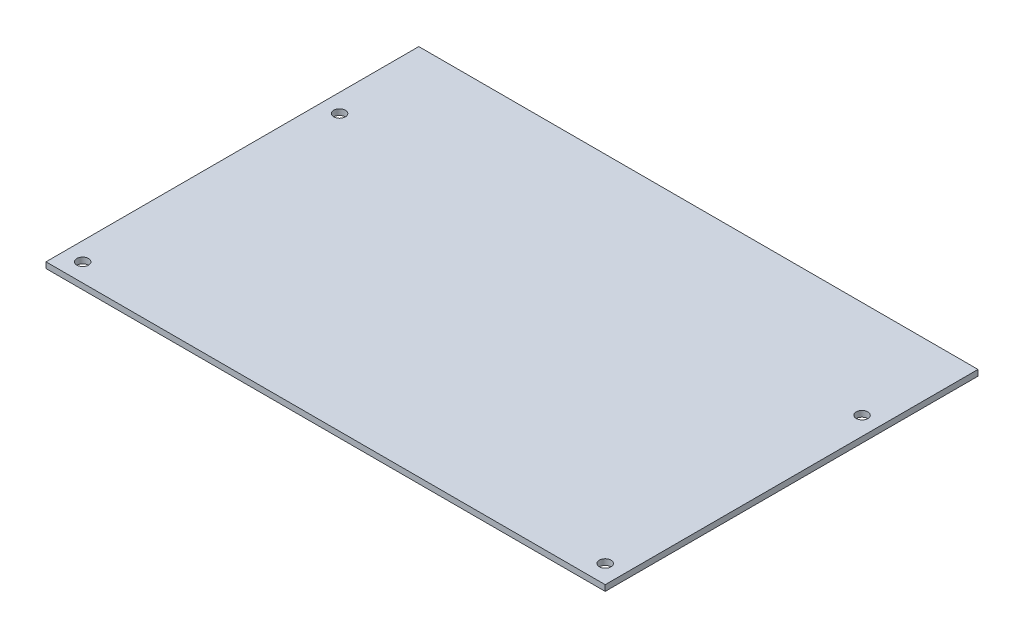
ISO-10303-21;
HEADER;
FILE_DESCRIPTION(('STEP AP214'),'2;1');
FILE_NAME('part.step','',(''),(''),'','','');
FILE_SCHEMA(('AUTOMOTIVE_DESIGN { 1 0 10303 214 1 1 1 1 }'));
ENDSEC;
DATA;
#1=APPLICATION_CONTEXT('core data for automotive mechanical design processes');
#2=APPLICATION_PROTOCOL_DEFINITION('international standard','automotive_design',2000,#1);
#3=PRODUCT_CONTEXT('',#1,'mechanical');
#4=PRODUCT('Part','Part','',(#3));
#5=PRODUCT_RELATED_PRODUCT_CATEGORY('part','',(#4));
#6=PRODUCT_DEFINITION_FORMATION('','',#4);
#7=PRODUCT_DEFINITION_CONTEXT('part definition',#1,'design');
#8=PRODUCT_DEFINITION('design','',#6,#7);
#9=PRODUCT_DEFINITION_SHAPE('','',#8);
#10=(LENGTH_UNIT() NAMED_UNIT(*) SI_UNIT(.MILLI.,.METRE.));
#11=(NAMED_UNIT(*) PLANE_ANGLE_UNIT() SI_UNIT($,.RADIAN.));
#12=(NAMED_UNIT(*) SI_UNIT($,.STERADIAN.) SOLID_ANGLE_UNIT());
#13=UNCERTAINTY_MEASURE_WITH_UNIT(LENGTH_MEASURE(1.E-05),#10,'distance_accuracy_value','');
#14=(GEOMETRIC_REPRESENTATION_CONTEXT(3) GLOBAL_UNCERTAINTY_ASSIGNED_CONTEXT((#13)) GLOBAL_UNIT_ASSIGNED_CONTEXT((#10,
#11,#12)) REPRESENTATION_CONTEXT('',''));
#15=CARTESIAN_POINT('',(0.,0.,0.));
#16=DIRECTION('',(0.,0.,1.));
#17=DIRECTION('',(1.,0.,0.));
#18=AXIS2_PLACEMENT_3D('',#15,#16,#17);
#19=CARTESIAN_POINT('',(0.,0.,0.));
#20=DIRECTION('',(0.,1.,0.));
#21=DIRECTION('',(0.,0.,1.));
#22=AXIS2_PLACEMENT_3D('',#19,#20,#21);
#23=PLANE('',#22);
#24=DIRECTION('',(-1.,0.,0.));
#25=VECTOR('',#24,1.);
#26=CARTESIAN_POINT('',(76.2,0.,-50.8));
#27=LINE('',#26,#25);
#28=CARTESIAN_POINT('',(-16.2,0.,-50.8));
#29=VERTEX_POINT('',#28);
#30=CARTESIAN_POINT('',(-76.2,0.,-50.8));
#31=VERTEX_POINT('',#30);
#32=EDGE_CURVE('E231',#29,#31,#27,.T.);
#33=ORIENTED_EDGE('',*,*,#32,.F.);
#34=DIRECTION('',(0.,0.,1.));
#35=VECTOR('',#34,1.);
#36=CARTESIAN_POINT('',(-16.2,0.,0.));
#37=LINE('',#36,#35);
#38=CARTESIAN_POINT('',(-16.2,0.,-30.8));
#39=VERTEX_POINT('',#38);
#40=EDGE_CURVE('E123',#29,#39,#37,.T.);
#41=ORIENTED_EDGE('',*,*,#40,.T.);
#42=DIRECTION('',(-1.,0.,0.));
#43=VECTOR('',#42,1.);
#44=CARTESIAN_POINT('',(0.,0.,-30.8));
#45=LINE('',#44,#43);
#46=CARTESIAN_POINT('',(-76.2,0.,-30.8));
#47=VERTEX_POINT('',#46);
#48=EDGE_CURVE('E120',#39,#47,#45,.T.);
#49=ORIENTED_EDGE('',*,*,#48,.T.);
#50=DIRECTION('',(0.,0.,1.));
#51=VECTOR('',#50,1.);
#52=CARTESIAN_POINT('',(-76.2,0.,50.8));
#53=LINE('',#52,#51);
#54=EDGE_CURVE('E225',#31,#47,#53,.T.);
#55=ORIENTED_EDGE('',*,*,#54,.F.);
#56=EDGE_LOOP('',(#33,#41,#49,#55));
#57=FACE_BOUND('',#56,.T.);
#58=DIRECTION('',(0.,0.,-1.));
#59=VECTOR('',#58,1.);
#60=CARTESIAN_POINT('',(-75.2,0.,0.));
#61=LINE('',#60,#59);
#62=CARTESIAN_POINT('',(-75.2,0.,-31.8));
#63=VERTEX_POINT('',#62);
#64=CARTESIAN_POINT('',(-75.2,0.,-49.8));
#65=VERTEX_POINT('',#64);
#66=EDGE_CURVE('E11',#63,#65,#61,.T.);
#67=ORIENTED_EDGE('',*,*,#66,.F.);
#68=DIRECTION('',(-1.,0.,0.));
#69=VECTOR('',#68,1.);
#70=CARTESIAN_POINT('',(0.,0.,-31.8));
#71=LINE('',#70,#69);
#72=CARTESIAN_POINT('',(-17.2,0.,-31.8));
#73=VERTEX_POINT('',#72);
#74=EDGE_CURVE('E131',#73,#63,#71,.T.);
#75=ORIENTED_EDGE('',*,*,#74,.F.);
#76=DIRECTION('',(0.,0.,1.));
#77=VECTOR('',#76,1.);
#78=CARTESIAN_POINT('',(-17.2,0.,0.));
#79=LINE('',#78,#77);
#80=CARTESIAN_POINT('',(-17.2,0.,-49.8));
#81=VERTEX_POINT('',#80);
#82=EDGE_CURVE('E134',#81,#73,#79,.T.);
#83=ORIENTED_EDGE('',*,*,#82,.F.);
#84=DIRECTION('',(1.,0.,0.));
#85=VECTOR('',#84,1.);
#86=CARTESIAN_POINT('',(0.,0.,-49.8));
#87=LINE('',#86,#85);
#88=EDGE_CURVE('E46',#65,#81,#87,.T.);
#89=ORIENTED_EDGE('',*,*,#88,.F.);
#90=EDGE_LOOP('',(#67,#75,#83,#89));
#91=FACE_BOUND('',#90,.T.);
#92=ADVANCED_FACE('F37',(#57,#91),#23,.F.);
#93=CARTESIAN_POINT('',(71.2,0.,45.8));
#94=DIRECTION('',(0.,-1.,0.));
#95=DIRECTION('',(0.,0.,-1.));
#96=AXIS2_PLACEMENT_3D('',#93,#94,#95);
#97=CIRCLE('',#96,1.5875);
#98=CARTESIAN_POINT('',(71.2,0.,44.2125));
#99=VERTEX_POINT('',#98);
#100=EDGE_CURVE('E214',#99,#99,#97,.T.);
#101=ORIENTED_EDGE('',*,*,#100,.F.);
#102=EDGE_LOOP('',(#101));
#103=FACE_BOUND('',#102,.T.);
#104=CARTESIAN_POINT('',(71.2,0.,-24.2));
#105=DIRECTION('',(0.,-1.,0.));
#106=DIRECTION('',(0.,0.,-1.));
#107=AXIS2_PLACEMENT_3D('',#104,#105,#106);
#108=CIRCLE('',#107,1.5875);
#109=CARTESIAN_POINT('',(71.2,0.,-25.7875));
#110=VERTEX_POINT('',#109);
#111=EDGE_CURVE('E207',#110,#110,#108,.T.);
#112=ORIENTED_EDGE('',*,*,#111,.F.);
#113=EDGE_LOOP('',(#112));
#114=FACE_BOUND('',#113,.T.);
#115=CARTESIAN_POINT('',(-71.2,0.,-24.2));
#116=DIRECTION('',(0.,-1.,0.));
#117=DIRECTION('',(0.,0.,-1.));
#118=AXIS2_PLACEMENT_3D('',#115,#116,#117);
#119=CIRCLE('',#118,1.5875);
#120=CARTESIAN_POINT('',(-71.2,0.,-25.7875));
#121=VERTEX_POINT('',#120);
#122=EDGE_CURVE('E200',#121,#121,#119,.T.);
#123=ORIENTED_EDGE('',*,*,#122,.F.);
#124=EDGE_LOOP('',(#123));
#125=FACE_BOUND('',#124,.T.);
#126=CARTESIAN_POINT('',(-71.2,0.,45.8));
#127=DIRECTION('',(0.,-1.,0.));
#128=DIRECTION('',(0.,0.,-1.));
#129=AXIS2_PLACEMENT_3D('',#126,#127,#128);
#130=CIRCLE('',#129,1.5875);
#131=CARTESIAN_POINT('',(-71.2,0.,44.2125));
#132=VERTEX_POINT('',#131);
#133=EDGE_CURVE('E204',#132,#132,#130,.T.);
#134=ORIENTED_EDGE('',*,*,#133,.F.);
#135=EDGE_LOOP('',(#134));
#136=FACE_BOUND('',#135,.T.);
#137=ORIENTED_EDGE('',*,*,#40,.F.);
#138=CARTESIAN_POINT('',(76.2,0.,-50.8));
#139=VERTEX_POINT('',#138);
#140=EDGE_CURVE('E114',#139,#29,#27,.T.);
#141=ORIENTED_EDGE('',*,*,#140,.F.);
#142=DIRECTION('',(0.,0.,-1.));
#143=VECTOR('',#142,1.);
#144=CARTESIAN_POINT('',(76.2,0.,50.8));
#145=LINE('',#144,#143);
#146=CARTESIAN_POINT('',(76.2,0.,50.8));
#147=VERTEX_POINT('',#146);
#148=EDGE_CURVE('E229',#147,#139,#145,.T.);
#149=ORIENTED_EDGE('',*,*,#148,.F.);
#150=DIRECTION('',(1.,0.,0.));
#151=VECTOR('',#150,1.);
#152=CARTESIAN_POINT('',(76.2,0.,50.8));
#153=LINE('',#152,#151);
#154=CARTESIAN_POINT('',(-76.2,0.,50.8));
#155=VERTEX_POINT('',#154);
#156=EDGE_CURVE('E227',#155,#147,#153,.T.);
#157=ORIENTED_EDGE('',*,*,#156,.F.);
#158=EDGE_CURVE('E118',#47,#155,#53,.T.);
#159=ORIENTED_EDGE('',*,*,#158,.F.);
#160=ORIENTED_EDGE('',*,*,#48,.F.);
#161=EDGE_LOOP('',(#137,#141,#149,#157,#159,#160));
#162=FACE_BOUND('',#161,.T.);
#163=ADVANCED_FACE('F153',(#103,#114,#125,#136,#162),#23,.F.);
#164=CARTESIAN_POINT('',(-76.2,1.6,50.8));
#165=DIRECTION('',(1.,0.,0.));
#166=DIRECTION('',(0.,0.,-1.));
#167=AXIS2_PLACEMENT_3D('',#164,#165,#166);
#168=PLANE('',#167);
#169=ORIENTED_EDGE('',*,*,#54,.T.);
#170=ORIENTED_EDGE('',*,*,#158,.T.);
#171=DIRECTION('',(0.,-1.,0.));
#172=VECTOR('',#171,1.);
#173=CARTESIAN_POINT('',(-76.2,1.6,50.8));
#174=LINE('',#173,#172);
#175=CARTESIAN_POINT('',(-76.2,1.6,50.8));
#176=VERTEX_POINT('',#175);
#177=EDGE_CURVE('E99',#176,#155,#174,.T.);
#178=ORIENTED_EDGE('',*,*,#177,.F.);
#179=DIRECTION('',(0.,0.,1.));
#180=VECTOR('',#179,1.);
#181=CARTESIAN_POINT('',(-76.2,1.6,50.8));
#182=LINE('',#181,#180);
#183=CARTESIAN_POINT('',(-76.2,1.6,-50.8));
#184=VERTEX_POINT('',#183);
#185=EDGE_CURVE('E105',#184,#176,#182,.T.);
#186=ORIENTED_EDGE('',*,*,#185,.F.);
#187=DIRECTION('',(0.,-1.,0.));
#188=VECTOR('',#187,1.);
#189=CARTESIAN_POINT('',(-76.2,1.6,-50.8));
#190=LINE('',#189,#188);
#191=EDGE_CURVE('E224',#184,#31,#190,.T.);
#192=ORIENTED_EDGE('',*,*,#191,.T.);
#193=EDGE_LOOP('',(#169,#170,#178,#186,#192));
#194=FACE_BOUND('',#193,.T.);
#195=ADVANCED_FACE('F39',(#194),#168,.F.);
#196=CARTESIAN_POINT('',(76.2,1.6,50.8));
#197=DIRECTION('',(0.,0.,-1.));
#198=DIRECTION('',(-1.,0.,0.));
#199=AXIS2_PLACEMENT_3D('',#196,#197,#198);
#200=PLANE('',#199);
#201=ORIENTED_EDGE('',*,*,#156,.T.);
#202=DIRECTION('',(0.,-1.,0.));
#203=VECTOR('',#202,1.);
#204=CARTESIAN_POINT('',(76.2,1.6,50.8));
#205=LINE('',#204,#203);
#206=CARTESIAN_POINT('',(76.2,1.6,50.8));
#207=VERTEX_POINT('',#206);
#208=EDGE_CURVE('E101',#207,#147,#205,.T.);
#209=ORIENTED_EDGE('',*,*,#208,.F.);
#210=DIRECTION('',(1.,0.,0.));
#211=VECTOR('',#210,1.);
#212=CARTESIAN_POINT('',(76.2,1.6,50.8));
#213=LINE('',#212,#211);
#214=EDGE_CURVE('E95',#176,#207,#213,.T.);
#215=ORIENTED_EDGE('',*,*,#214,.F.);
#216=ORIENTED_EDGE('',*,*,#177,.T.);
#217=EDGE_LOOP('',(#201,#209,#215,#216));
#218=FACE_BOUND('',#217,.T.);
#219=ADVANCED_FACE('F97',(#218),#200,.F.);
#220=CARTESIAN_POINT('',(76.2,1.6,50.8));
#221=DIRECTION('',(-1.,0.,0.));
#222=DIRECTION('',(0.,0.,1.));
#223=AXIS2_PLACEMENT_3D('',#220,#221,#222);
#224=PLANE('',#223);
#225=ORIENTED_EDGE('',*,*,#148,.T.);
#226=DIRECTION('',(0.,-1.,0.));
#227=VECTOR('',#226,1.);
#228=CARTESIAN_POINT('',(76.2,1.6,-50.8));
#229=LINE('',#228,#227);
#230=CARTESIAN_POINT('',(76.2,1.6,-50.8));
#231=VERTEX_POINT('',#230);
#232=EDGE_CURVE('E125',#231,#139,#229,.T.);
#233=ORIENTED_EDGE('',*,*,#232,.F.);
#234=DIRECTION('',(0.,0.,-1.));
#235=VECTOR('',#234,1.);
#236=CARTESIAN_POINT('',(76.2,1.6,50.8));
#237=LINE('',#236,#235);
#238=EDGE_CURVE('E104',#207,#231,#237,.T.);
#239=ORIENTED_EDGE('',*,*,#238,.F.);
#240=ORIENTED_EDGE('',*,*,#208,.T.);
#241=EDGE_LOOP('',(#225,#233,#239,#240));
#242=FACE_BOUND('',#241,.T.);
#243=ADVANCED_FACE('F177',(#242),#224,.F.);
#244=CARTESIAN_POINT('',(76.2,1.6,-50.8));
#245=DIRECTION('',(0.,0.,1.));
#246=DIRECTION('',(1.,0.,0.));
#247=AXIS2_PLACEMENT_3D('',#244,#245,#246);
#248=PLANE('',#247);
#249=ORIENTED_EDGE('',*,*,#140,.T.);
#250=ORIENTED_EDGE('',*,*,#32,.T.);
#251=ORIENTED_EDGE('',*,*,#191,.F.);
#252=DIRECTION('',(-1.,0.,0.));
#253=VECTOR('',#252,1.);
#254=CARTESIAN_POINT('',(76.2,1.6,-50.8));
#255=LINE('',#254,#253);
#256=EDGE_CURVE('E110',#231,#184,#255,.T.);
#257=ORIENTED_EDGE('',*,*,#256,.F.);
#258=ORIENTED_EDGE('',*,*,#232,.T.);
#259=EDGE_LOOP('',(#249,#250,#251,#257,#258));
#260=FACE_BOUND('',#259,.T.);
#261=ADVANCED_FACE('F172',(#260),#248,.F.);
#262=CARTESIAN_POINT('',(0.,1.6,0.));
#263=DIRECTION('',(0.,1.,0.));
#264=DIRECTION('',(0.,0.,1.));
#265=AXIS2_PLACEMENT_3D('',#262,#263,#264);
#266=PLANE('',#265);
#267=CARTESIAN_POINT('',(71.2,1.6,45.8));
#268=DIRECTION('',(0.,-1.,0.));
#269=DIRECTION('',(0.,0.,-1.));
#270=AXIS2_PLACEMENT_3D('',#267,#268,#269);
#271=CIRCLE('',#270,1.5875);
#272=CARTESIAN_POINT('',(71.2,1.6,44.2125));
#273=VERTEX_POINT('',#272);
#274=EDGE_CURVE('E212',#273,#273,#271,.T.);
#275=ORIENTED_EDGE('',*,*,#274,.T.);
#276=EDGE_LOOP('',(#275));
#277=FACE_BOUND('',#276,.T.);
#278=CARTESIAN_POINT('',(71.2,1.6,-24.2));
#279=DIRECTION('',(0.,-1.,0.));
#280=DIRECTION('',(0.,0.,-1.));
#281=AXIS2_PLACEMENT_3D('',#278,#279,#280);
#282=CIRCLE('',#281,1.5875);
#283=CARTESIAN_POINT('',(71.2,1.6,-25.7875));
#284=VERTEX_POINT('',#283);
#285=EDGE_CURVE('E202',#284,#284,#282,.T.);
#286=ORIENTED_EDGE('',*,*,#285,.T.);
#287=EDGE_LOOP('',(#286));
#288=FACE_BOUND('',#287,.T.);
#289=CARTESIAN_POINT('',(-71.2,1.6,-24.2));
#290=DIRECTION('',(0.,-1.,0.));
#291=DIRECTION('',(0.,0.,-1.));
#292=AXIS2_PLACEMENT_3D('',#289,#290,#291);
#293=CIRCLE('',#292,1.5875);
#294=CARTESIAN_POINT('',(-71.2,1.6,-25.7875));
#295=VERTEX_POINT('',#294);
#296=EDGE_CURVE('E197',#295,#295,#293,.T.);
#297=ORIENTED_EDGE('',*,*,#296,.T.);
#298=EDGE_LOOP('',(#297));
#299=FACE_BOUND('',#298,.T.);
#300=CARTESIAN_POINT('',(-71.2,1.6,45.8));
#301=DIRECTION('',(0.,-1.,0.));
#302=DIRECTION('',(0.,0.,-1.));
#303=AXIS2_PLACEMENT_3D('',#300,#301,#302);
#304=CIRCLE('',#303,1.5875);
#305=CARTESIAN_POINT('',(-71.2,1.6,44.2125));
#306=VERTEX_POINT('',#305);
#307=EDGE_CURVE('E217',#306,#306,#304,.T.);
#308=ORIENTED_EDGE('',*,*,#307,.T.);
#309=EDGE_LOOP('',(#308));
#310=FACE_BOUND('',#309,.T.);
#311=ORIENTED_EDGE('',*,*,#185,.T.);
#312=ORIENTED_EDGE('',*,*,#214,.T.);
#313=ORIENTED_EDGE('',*,*,#238,.T.);
#314=ORIENTED_EDGE('',*,*,#256,.T.);
#315=EDGE_LOOP('',(#311,#312,#313,#314));
#316=FACE_BOUND('',#315,.T.);
#317=ADVANCED_FACE('F108',(#277,#288,#299,#310,#316),#266,.T.);
#318=ORIENTED_EDGE('',*,*,#74,.T.);
#319=ORIENTED_EDGE('',*,*,#66,.T.);
#320=ORIENTED_EDGE('',*,*,#88,.T.);
#321=ORIENTED_EDGE('',*,*,#82,.T.);
#322=EDGE_LOOP('',(#318,#319,#320,#321));
#323=FACE_BOUND('',#322,.T.);
#324=ADVANCED_FACE('F150',(#323),#23,.F.);
#325=CARTESIAN_POINT('',(-71.2,1.6,45.8));
#326=DIRECTION('',(0.,-1.,0.));
#327=DIRECTION('',(0.,0.,-1.));
#328=AXIS2_PLACEMENT_3D('',#325,#326,#327);
#329=CYLINDRICAL_SURFACE('',#328,1.5875);
#330=ORIENTED_EDGE('',*,*,#307,.F.);
#331=EDGE_LOOP('',(#330));
#332=FACE_BOUND('',#331,.T.);
#333=ORIENTED_EDGE('',*,*,#133,.T.);
#334=EDGE_LOOP('',(#333));
#335=FACE_BOUND('',#334,.T.);
#336=ADVANCED_FACE('F164',(#332,#335),#329,.F.);
#337=CARTESIAN_POINT('',(-71.2,1.6,-24.2));
#338=DIRECTION('',(0.,-1.,0.));
#339=DIRECTION('',(0.,0.,-1.));
#340=AXIS2_PLACEMENT_3D('',#337,#338,#339);
#341=CYLINDRICAL_SURFACE('',#340,1.5875);
#342=ORIENTED_EDGE('',*,*,#296,.F.);
#343=EDGE_LOOP('',(#342));
#344=FACE_BOUND('',#343,.T.);
#345=ORIENTED_EDGE('',*,*,#122,.T.);
#346=EDGE_LOOP('',(#345));
#347=FACE_BOUND('',#346,.T.);
#348=ADVANCED_FACE('F169',(#344,#347),#341,.F.);
#349=CARTESIAN_POINT('',(71.2,1.6,-24.2));
#350=DIRECTION('',(0.,-1.,0.));
#351=DIRECTION('',(0.,0.,-1.));
#352=AXIS2_PLACEMENT_3D('',#349,#350,#351);
#353=CYLINDRICAL_SURFACE('',#352,1.5875);
#354=ORIENTED_EDGE('',*,*,#285,.F.);
#355=EDGE_LOOP('',(#354));
#356=FACE_BOUND('',#355,.T.);
#357=ORIENTED_EDGE('',*,*,#111,.T.);
#358=EDGE_LOOP('',(#357));
#359=FACE_BOUND('',#358,.T.);
#360=ADVANCED_FACE('F185',(#356,#359),#353,.F.);
#361=CARTESIAN_POINT('',(71.2,1.6,45.8));
#362=DIRECTION('',(0.,-1.,0.));
#363=DIRECTION('',(0.,0.,-1.));
#364=AXIS2_PLACEMENT_3D('',#361,#362,#363);
#365=CYLINDRICAL_SURFACE('',#364,1.5875);
#366=ORIENTED_EDGE('',*,*,#274,.F.);
#367=EDGE_LOOP('',(#366));
#368=FACE_BOUND('',#367,.T.);
#369=ORIENTED_EDGE('',*,*,#100,.T.);
#370=EDGE_LOOP('',(#369));
#371=FACE_BOUND('',#370,.T.);
#372=ADVANCED_FACE('F182',(#368,#371),#365,.F.);
#373=CLOSED_SHELL('',(#92,#163,#195,#219,#243,#261,#317,#324,#336,#348,#360,#372));
#374=MANIFOLD_SOLID_BREP('B2',#373);
#375=ADVANCED_BREP_SHAPE_REPRESENTATION('',(#18,#374),#14);
#376=SHAPE_DEFINITION_REPRESENTATION(#9,#375);
ENDSEC;
END-ISO-10303-21;
